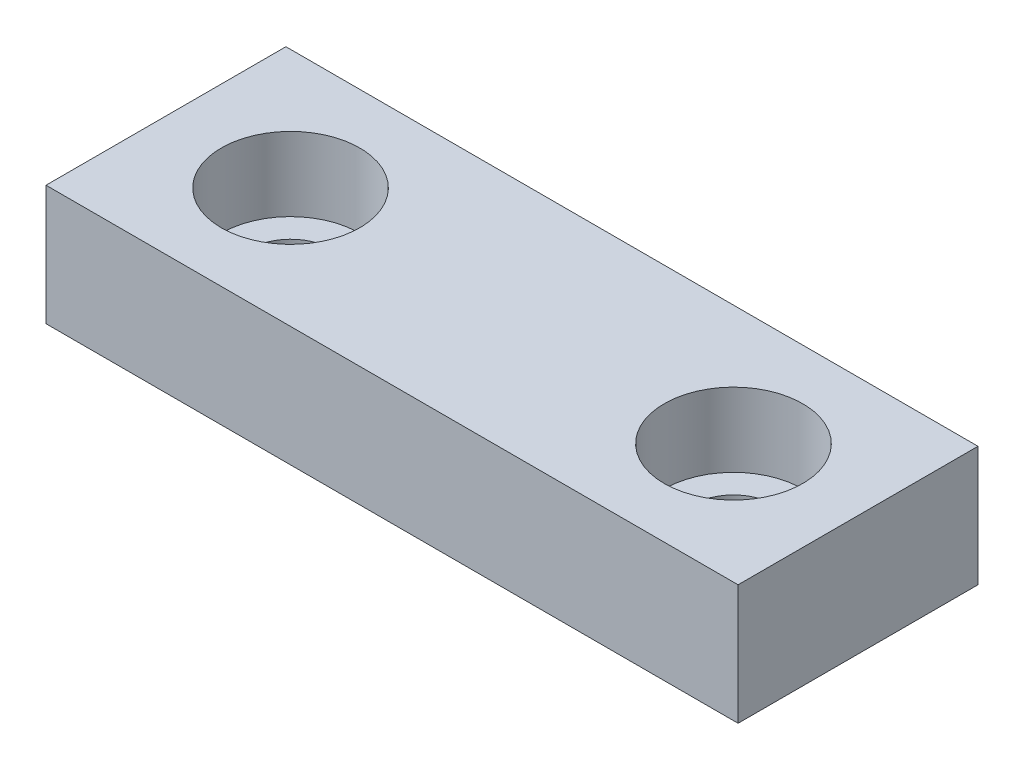
ISO-10303-21;
HEADER;
FILE_DESCRIPTION(('STEP AP214'),'2;1');
FILE_NAME('part.step','',(''),(''),'','','');
FILE_SCHEMA(('AUTOMOTIVE_DESIGN { 1 0 10303 214 1 1 1 1 }'));
ENDSEC;
DATA;
#1=APPLICATION_CONTEXT('core data for automotive mechanical design processes');
#2=APPLICATION_PROTOCOL_DEFINITION('international standard','automotive_design',2000,#1);
#3=PRODUCT_CONTEXT('',#1,'mechanical');
#4=PRODUCT('Part','Part','',(#3));
#5=PRODUCT_RELATED_PRODUCT_CATEGORY('part','',(#4));
#6=PRODUCT_DEFINITION_FORMATION('','',#4);
#7=PRODUCT_DEFINITION_CONTEXT('part definition',#1,'design');
#8=PRODUCT_DEFINITION('design','',#6,#7);
#9=PRODUCT_DEFINITION_SHAPE('','',#8);
#10=(LENGTH_UNIT() NAMED_UNIT(*) SI_UNIT(.MILLI.,.METRE.));
#11=(NAMED_UNIT(*) PLANE_ANGLE_UNIT() SI_UNIT($,.RADIAN.));
#12=(NAMED_UNIT(*) SI_UNIT($,.STERADIAN.) SOLID_ANGLE_UNIT());
#13=UNCERTAINTY_MEASURE_WITH_UNIT(LENGTH_MEASURE(1.E-05),#10,'distance_accuracy_value','');
#14=(GEOMETRIC_REPRESENTATION_CONTEXT(3) GLOBAL_UNCERTAINTY_ASSIGNED_CONTEXT((#13)) GLOBAL_UNIT_ASSIGNED_CONTEXT((#10,
#11,#12)) REPRESENTATION_CONTEXT('',''));
#15=CARTESIAN_POINT('',(0.,0.,0.));
#16=DIRECTION('',(0.,0.,1.));
#17=DIRECTION('',(1.,0.,0.));
#18=AXIS2_PLACEMENT_3D('',#15,#16,#17);
#19=CARTESIAN_POINT('',(37.5,0.,-13.));
#20=DIRECTION('',(0.,-1.,0.));
#21=DIRECTION('',(0.,0.,-1.));
#22=AXIS2_PLACEMENT_3D('',#19,#20,#21);
#23=PLANE('',#22);
#24=CARTESIAN_POINT('',(-24.,0.,0.));
#25=DIRECTION('',(0.,1.,0.));
#26=DIRECTION('',(0.,0.,1.));
#27=AXIS2_PLACEMENT_3D('',#24,#25,#26);
#28=CIRCLE('',#27,4.5);
#29=CARTESIAN_POINT('',(-24.,0.,4.5));
#30=VERTEX_POINT('',#29);
#31=EDGE_CURVE('E140',#30,#30,#28,.T.);
#32=ORIENTED_EDGE('',*,*,#31,.T.);
#33=EDGE_LOOP('',(#32));
#34=FACE_BOUND('',#33,.T.);
#35=DIRECTION('',(0.,0.,-1.));
#36=VECTOR('',#35,1.);
#37=CARTESIAN_POINT('',(37.5,0.,13.));
#38=LINE('',#37,#36);
#39=CARTESIAN_POINT('',(37.5,0.,13.));
#40=VERTEX_POINT('',#39);
#41=CARTESIAN_POINT('',(37.5,0.,-13.));
#42=VERTEX_POINT('',#41);
#43=EDGE_CURVE('E106',#40,#42,#38,.T.);
#44=ORIENTED_EDGE('',*,*,#43,.F.);
#45=DIRECTION('',(1.,0.,0.));
#46=VECTOR('',#45,1.);
#47=CARTESIAN_POINT('',(-37.5,0.,13.));
#48=LINE('',#47,#46);
#49=CARTESIAN_POINT('',(-37.5,0.,13.));
#50=VERTEX_POINT('',#49);
#51=EDGE_CURVE('E77',#50,#40,#48,.T.);
#52=ORIENTED_EDGE('',*,*,#51,.F.);
#53=DIRECTION('',(0.,0.,1.));
#54=VECTOR('',#53,1.);
#55=CARTESIAN_POINT('',(-37.5,0.,13.));
#56=LINE('',#55,#54);
#57=CARTESIAN_POINT('',(-37.5,0.,-13.));
#58=VERTEX_POINT('',#57);
#59=EDGE_CURVE('E71',#58,#50,#56,.T.);
#60=ORIENTED_EDGE('',*,*,#59,.F.);
#61=DIRECTION('',(-1.,0.,0.));
#62=VECTOR('',#61,1.);
#63=CARTESIAN_POINT('',(-37.5,0.,-13.));
#64=LINE('',#63,#62);
#65=EDGE_CURVE('E94',#42,#58,#64,.T.);
#66=ORIENTED_EDGE('',*,*,#65,.F.);
#67=EDGE_LOOP('',(#44,#52,#60,#66));
#68=FACE_BOUND('',#67,.T.);
#69=CARTESIAN_POINT('',(24.,0.,0.));
#70=DIRECTION('',(0.,1.,0.));
#71=DIRECTION('',(0.,0.,1.));
#72=AXIS2_PLACEMENT_3D('',#69,#70,#71);
#73=CIRCLE('',#72,4.5);
#74=CARTESIAN_POINT('',(24.,0.,4.5));
#75=VERTEX_POINT('',#74);
#76=EDGE_CURVE('E156',#75,#75,#73,.T.);
#77=ORIENTED_EDGE('',*,*,#76,.T.);
#78=EDGE_LOOP('',(#77));
#79=FACE_BOUND('',#78,.T.);
#80=ADVANCED_FACE('F36',(#34,#68,#79),#23,.T.);
#81=CARTESIAN_POINT('',(37.5,13.,13.));
#82=DIRECTION('',(-1.,0.,0.));
#83=DIRECTION('',(0.,0.,1.));
#84=AXIS2_PLACEMENT_3D('',#81,#82,#83);
#85=PLANE('',#84);
#86=ORIENTED_EDGE('',*,*,#43,.T.);
#87=DIRECTION('',(0.,-1.,0.));
#88=VECTOR('',#87,1.);
#89=CARTESIAN_POINT('',(37.5,13.,-13.));
#90=LINE('',#89,#88);
#91=CARTESIAN_POINT('',(37.5,13.,-13.));
#92=VERTEX_POINT('',#91);
#93=EDGE_CURVE('E11',#92,#42,#90,.T.);
#94=ORIENTED_EDGE('',*,*,#93,.F.);
#95=DIRECTION('',(0.,0.,-1.));
#96=VECTOR('',#95,1.);
#97=CARTESIAN_POINT('',(37.5,13.,13.));
#98=LINE('',#97,#96);
#99=CARTESIAN_POINT('',(37.5,13.,13.));
#100=VERTEX_POINT('',#99);
#101=EDGE_CURVE('E89',#100,#92,#98,.T.);
#102=ORIENTED_EDGE('',*,*,#101,.F.);
#103=DIRECTION('',(0.,-1.,0.));
#104=VECTOR('',#103,1.);
#105=CARTESIAN_POINT('',(37.5,13.,13.));
#106=LINE('',#105,#104);
#107=EDGE_CURVE('E102',#100,#40,#106,.T.);
#108=ORIENTED_EDGE('',*,*,#107,.T.);
#109=EDGE_LOOP('',(#86,#94,#102,#108));
#110=FACE_BOUND('',#109,.T.);
#111=ADVANCED_FACE('F38',(#110),#85,.F.);
#112=CARTESIAN_POINT('',(-37.5,13.,-13.));
#113=DIRECTION('',(0.,0.,1.));
#114=DIRECTION('',(1.,0.,0.));
#115=AXIS2_PLACEMENT_3D('',#112,#113,#114);
#116=PLANE('',#115);
#117=ORIENTED_EDGE('',*,*,#65,.T.);
#118=DIRECTION('',(0.,-1.,0.));
#119=VECTOR('',#118,1.);
#120=CARTESIAN_POINT('',(-37.5,13.,-13.));
#121=LINE('',#120,#119);
#122=CARTESIAN_POINT('',(-37.5,13.,-13.));
#123=VERTEX_POINT('',#122);
#124=EDGE_CURVE('E46',#123,#58,#121,.T.);
#125=ORIENTED_EDGE('',*,*,#124,.F.);
#126=DIRECTION('',(-1.,0.,0.));
#127=VECTOR('',#126,1.);
#128=CARTESIAN_POINT('',(-37.5,13.,-13.));
#129=LINE('',#128,#127);
#130=EDGE_CURVE('E84',#92,#123,#129,.T.);
#131=ORIENTED_EDGE('',*,*,#130,.F.);
#132=ORIENTED_EDGE('',*,*,#93,.T.);
#133=EDGE_LOOP('',(#117,#125,#131,#132));
#134=FACE_BOUND('',#133,.T.);
#135=ADVANCED_FACE('F93',(#134),#116,.F.);
#136=CARTESIAN_POINT('',(-37.5,13.,13.));
#137=DIRECTION('',(1.,0.,0.));
#138=DIRECTION('',(0.,0.,-1.));
#139=AXIS2_PLACEMENT_3D('',#136,#137,#138);
#140=PLANE('',#139);
#141=ORIENTED_EDGE('',*,*,#59,.T.);
#142=DIRECTION('',(0.,-1.,0.));
#143=VECTOR('',#142,1.);
#144=CARTESIAN_POINT('',(-37.5,13.,13.));
#145=LINE('',#144,#143);
#146=CARTESIAN_POINT('',(-37.5,13.,13.));
#147=VERTEX_POINT('',#146);
#148=EDGE_CURVE('E96',#147,#50,#145,.T.);
#149=ORIENTED_EDGE('',*,*,#148,.F.);
#150=DIRECTION('',(0.,0.,1.));
#151=VECTOR('',#150,1.);
#152=CARTESIAN_POINT('',(-37.5,13.,13.));
#153=LINE('',#152,#151);
#154=EDGE_CURVE('E87',#123,#147,#153,.T.);
#155=ORIENTED_EDGE('',*,*,#154,.F.);
#156=ORIENTED_EDGE('',*,*,#124,.T.);
#157=EDGE_LOOP('',(#141,#149,#155,#156));
#158=FACE_BOUND('',#157,.T.);
#159=ADVANCED_FACE('F97',(#158),#140,.F.);
#160=CARTESIAN_POINT('',(-37.5,13.,13.));
#161=DIRECTION('',(0.,0.,-1.));
#162=DIRECTION('',(-1.,0.,0.));
#163=AXIS2_PLACEMENT_3D('',#160,#161,#162);
#164=PLANE('',#163);
#165=ORIENTED_EDGE('',*,*,#51,.T.);
#166=ORIENTED_EDGE('',*,*,#107,.F.);
#167=DIRECTION('',(1.,0.,0.));
#168=VECTOR('',#167,1.);
#169=CARTESIAN_POINT('',(-37.5,13.,13.));
#170=LINE('',#169,#168);
#171=EDGE_CURVE('E54',#147,#100,#170,.T.);
#172=ORIENTED_EDGE('',*,*,#171,.F.);
#173=ORIENTED_EDGE('',*,*,#148,.T.);
#174=EDGE_LOOP('',(#165,#166,#172,#173));
#175=FACE_BOUND('',#174,.T.);
#176=ADVANCED_FACE('F121',(#175),#164,.F.);
#177=CARTESIAN_POINT('',(37.5,13.,-13.));
#178=DIRECTION('',(0.,-1.,0.));
#179=DIRECTION('',(0.,0.,-1.));
#180=AXIS2_PLACEMENT_3D('',#177,#178,#179);
#181=PLANE('',#180);
#182=CARTESIAN_POINT('',(24.,13.,0.));
#183=DIRECTION('',(0.,1.,0.));
#184=DIRECTION('',(0.,0.,1.));
#185=AXIS2_PLACEMENT_3D('',#182,#183,#184);
#186=CIRCLE('',#185,7.5);
#187=CARTESIAN_POINT('',(24.,13.,7.5));
#188=VERTEX_POINT('',#187);
#189=EDGE_CURVE('E144',#188,#188,#186,.T.);
#190=ORIENTED_EDGE('',*,*,#189,.F.);
#191=EDGE_LOOP('',(#190));
#192=FACE_BOUND('',#191,.T.);
#193=CARTESIAN_POINT('',(-24.,13.,0.));
#194=DIRECTION('',(0.,1.,0.));
#195=DIRECTION('',(0.,0.,1.));
#196=AXIS2_PLACEMENT_3D('',#193,#194,#195);
#197=CIRCLE('',#196,7.5);
#198=CARTESIAN_POINT('',(-24.,13.,7.5));
#199=VERTEX_POINT('',#198);
#200=EDGE_CURVE('E110',#199,#199,#197,.T.);
#201=ORIENTED_EDGE('',*,*,#200,.F.);
#202=EDGE_LOOP('',(#201));
#203=FACE_BOUND('',#202,.T.);
#204=ORIENTED_EDGE('',*,*,#101,.T.);
#205=ORIENTED_EDGE('',*,*,#130,.T.);
#206=ORIENTED_EDGE('',*,*,#154,.T.);
#207=ORIENTED_EDGE('',*,*,#171,.T.);
#208=EDGE_LOOP('',(#204,#205,#206,#207));
#209=FACE_BOUND('',#208,.T.);
#210=ADVANCED_FACE('F85',(#192,#203,#209),#181,.F.);
#211=CARTESIAN_POINT('',(-24.,13.,0.));
#212=DIRECTION('',(0.,1.,0.));
#213=DIRECTION('',(0.,0.,1.));
#214=AXIS2_PLACEMENT_3D('',#211,#212,#213);
#215=CYLINDRICAL_SURFACE('',#214,7.5);
#216=CARTESIAN_POINT('',(-24.,5.,0.));
#217=DIRECTION('',(0.,1.,0.));
#218=DIRECTION('',(0.,0.,1.));
#219=AXIS2_PLACEMENT_3D('',#216,#217,#218);
#220=CIRCLE('',#219,7.5);
#221=CARTESIAN_POINT('',(-24.,5.,7.5));
#222=VERTEX_POINT('',#221);
#223=EDGE_CURVE('E132',#222,#222,#220,.T.);
#224=ORIENTED_EDGE('',*,*,#223,.F.);
#225=EDGE_LOOP('',(#224));
#226=FACE_BOUND('',#225,.T.);
#227=ORIENTED_EDGE('',*,*,#200,.T.);
#228=EDGE_LOOP('',(#227));
#229=FACE_BOUND('',#228,.T.);
#230=ADVANCED_FACE('F183',(#226,#229),#215,.F.);
#231=CARTESIAN_POINT('',(-19.5,5.,0.));
#232=DIRECTION('',(0.,-1.,0.));
#233=DIRECTION('',(0.,0.,-1.));
#234=AXIS2_PLACEMENT_3D('',#231,#232,#233);
#235=PLANE('',#234);
#236=CARTESIAN_POINT('',(-24.,5.,0.));
#237=DIRECTION('',(0.,1.,0.));
#238=DIRECTION('',(0.,0.,1.));
#239=AXIS2_PLACEMENT_3D('',#236,#237,#238);
#240=CIRCLE('',#239,4.5);
#241=CARTESIAN_POINT('',(-24.,5.,4.5));
#242=VERTEX_POINT('',#241);
#243=EDGE_CURVE('E136',#242,#242,#240,.T.);
#244=ORIENTED_EDGE('',*,*,#243,.F.);
#245=EDGE_LOOP('',(#244));
#246=FACE_BOUND('',#245,.T.);
#247=ORIENTED_EDGE('',*,*,#223,.T.);
#248=EDGE_LOOP('',(#247));
#249=FACE_BOUND('',#248,.T.);
#250=ADVANCED_FACE('F188',(#246,#249),#235,.F.);
#251=CARTESIAN_POINT('',(-24.,13.,0.));
#252=DIRECTION('',(0.,1.,0.));
#253=DIRECTION('',(0.,0.,1.));
#254=AXIS2_PLACEMENT_3D('',#251,#252,#253);
#255=CYLINDRICAL_SURFACE('',#254,4.5);
#256=ORIENTED_EDGE('',*,*,#31,.F.);
#257=EDGE_LOOP('',(#256));
#258=FACE_BOUND('',#257,.T.);
#259=ORIENTED_EDGE('',*,*,#243,.T.);
#260=EDGE_LOOP('',(#259));
#261=FACE_BOUND('',#260,.T.);
#262=ADVANCED_FACE('F177',(#258,#261),#255,.F.);
#263=CARTESIAN_POINT('',(24.,13.,0.));
#264=DIRECTION('',(0.,1.,0.));
#265=DIRECTION('',(0.,0.,1.));
#266=AXIS2_PLACEMENT_3D('',#263,#264,#265);
#267=CYLINDRICAL_SURFACE('',#266,7.5);
#268=CARTESIAN_POINT('',(24.,5.,0.));
#269=DIRECTION('',(0.,1.,0.));
#270=DIRECTION('',(0.,0.,1.));
#271=AXIS2_PLACEMENT_3D('',#268,#269,#270);
#272=CIRCLE('',#271,7.5);
#273=CARTESIAN_POINT('',(24.,5.,7.5));
#274=VERTEX_POINT('',#273);
#275=EDGE_CURVE('E148',#274,#274,#272,.T.);
#276=ORIENTED_EDGE('',*,*,#275,.F.);
#277=EDGE_LOOP('',(#276));
#278=FACE_BOUND('',#277,.T.);
#279=ORIENTED_EDGE('',*,*,#189,.T.);
#280=EDGE_LOOP('',(#279));
#281=FACE_BOUND('',#280,.T.);
#282=ADVANCED_FACE('F171',(#278,#281),#267,.F.);
#283=CARTESIAN_POINT('',(28.5,5.,0.));
#284=DIRECTION('',(0.,-1.,0.));
#285=DIRECTION('',(0.,0.,-1.));
#286=AXIS2_PLACEMENT_3D('',#283,#284,#285);
#287=PLANE('',#286);
#288=CARTESIAN_POINT('',(24.,5.,0.));
#289=DIRECTION('',(0.,1.,0.));
#290=DIRECTION('',(0.,0.,1.));
#291=AXIS2_PLACEMENT_3D('',#288,#289,#290);
#292=CIRCLE('',#291,4.5);
#293=CARTESIAN_POINT('',(24.,5.,4.5));
#294=VERTEX_POINT('',#293);
#295=EDGE_CURVE('E152',#294,#294,#292,.T.);
#296=ORIENTED_EDGE('',*,*,#295,.F.);
#297=EDGE_LOOP('',(#296));
#298=FACE_BOUND('',#297,.T.);
#299=ORIENTED_EDGE('',*,*,#275,.T.);
#300=EDGE_LOOP('',(#299));
#301=FACE_BOUND('',#300,.T.);
#302=ADVANCED_FACE('F165',(#298,#301),#287,.F.);
#303=CARTESIAN_POINT('',(24.,13.,0.));
#304=DIRECTION('',(0.,1.,0.));
#305=DIRECTION('',(0.,0.,1.));
#306=AXIS2_PLACEMENT_3D('',#303,#304,#305);
#307=CYLINDRICAL_SURFACE('',#306,4.5);
#308=ORIENTED_EDGE('',*,*,#76,.F.);
#309=EDGE_LOOP('',(#308));
#310=FACE_BOUND('',#309,.T.);
#311=ORIENTED_EDGE('',*,*,#295,.T.);
#312=EDGE_LOOP('',(#311));
#313=FACE_BOUND('',#312,.T.);
#314=ADVANCED_FACE('F162',(#310,#313),#307,.F.);
#315=CLOSED_SHELL('',(#80,#111,#135,#159,#176,#210,#230,#250,#262,#282,#302,#314));
#316=MANIFOLD_SOLID_BREP('B2',#315);
#317=ADVANCED_BREP_SHAPE_REPRESENTATION('',(#18,#316),#14);
#318=SHAPE_DEFINITION_REPRESENTATION(#9,#317);
ENDSEC;
END-ISO-10303-21;
